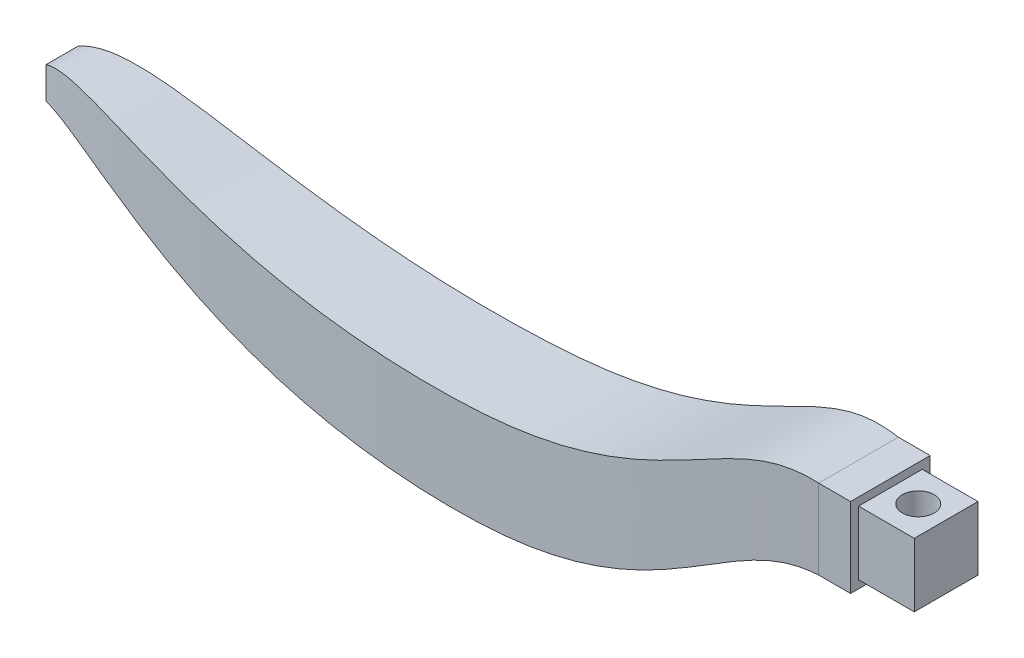
ISO-10303-21;
HEADER;
FILE_DESCRIPTION(('STEP AP214'),'2;1');
FILE_NAME('part.step','',(''),(''),'','','');
FILE_SCHEMA(('AUTOMOTIVE_DESIGN { 1 0 10303 214 1 1 1 1 }'));
ENDSEC;
DATA;
#1=APPLICATION_CONTEXT('core data for automotive mechanical design processes');
#2=APPLICATION_PROTOCOL_DEFINITION('international standard','automotive_design',2000,#1);
#3=PRODUCT_CONTEXT('',#1,'mechanical');
#4=PRODUCT('Part','Part','',(#3));
#5=PRODUCT_RELATED_PRODUCT_CATEGORY('part','',(#4));
#6=PRODUCT_DEFINITION_FORMATION('','',#4);
#7=PRODUCT_DEFINITION_CONTEXT('part definition',#1,'design');
#8=PRODUCT_DEFINITION('design','',#6,#7);
#9=PRODUCT_DEFINITION_SHAPE('','',#8);
#10=(LENGTH_UNIT() NAMED_UNIT(*) SI_UNIT(.MILLI.,.METRE.));
#11=(NAMED_UNIT(*) PLANE_ANGLE_UNIT() SI_UNIT($,.RADIAN.));
#12=(NAMED_UNIT(*) SI_UNIT($,.STERADIAN.) SOLID_ANGLE_UNIT());
#13=UNCERTAINTY_MEASURE_WITH_UNIT(LENGTH_MEASURE(1.E-05),#10,'distance_accuracy_value','');
#14=(GEOMETRIC_REPRESENTATION_CONTEXT(3) GLOBAL_UNCERTAINTY_ASSIGNED_CONTEXT((#13)) GLOBAL_UNIT_ASSIGNED_CONTEXT((#10,
#11,#12)) REPRESENTATION_CONTEXT('',''));
#15=CARTESIAN_POINT('',(0.,0.,0.));
#16=DIRECTION('',(0.,0.,1.));
#17=DIRECTION('',(1.,0.,0.));
#18=AXIS2_PLACEMENT_3D('',#15,#16,#17);
#19=CARTESIAN_POINT('',(52.,-6.42194630806614E-12,0.));
#20=DIRECTION('',(1.,-1.23512311489549E-13,0.));
#21=DIRECTION('',(1.23512311489549E-13,1.,0.));
#22=AXIS2_PLACEMENT_3D('',#19,#20,#21);
#23=PLANE('',#22);
#24=DIRECTION('',(-1.23512311489549E-13,-1.,0.));
#25=VECTOR('',#24,1.);
#26=CARTESIAN_POINT('',(52.0000000000006,4.99999999999358,2.5));
#27=LINE('',#26,#25);
#28=CARTESIAN_POINT('',(52.0000000000006,4.99999999999358,2.5));
#29=VERTEX_POINT('',#28);
#30=CARTESIAN_POINT('',(52.,-6.42194630806614E-12,2.5));
#31=VERTEX_POINT('',#30);
#32=EDGE_CURVE('E293',#29,#31,#27,.T.);
#33=ORIENTED_EDGE('',*,*,#32,.T.);
#34=DIRECTION('',(0.,0.,-1.));
#35=VECTOR('',#34,1.);
#36=CARTESIAN_POINT('',(52.,-6.42194630806614E-12,2.5));
#37=LINE('',#36,#35);
#38=CARTESIAN_POINT('',(52.,-6.42194630806614E-12,-2.5));
#39=VERTEX_POINT('',#38);
#40=EDGE_CURVE('E290',#31,#39,#37,.T.);
#41=ORIENTED_EDGE('',*,*,#40,.T.);
#42=DIRECTION('',(1.23512311489549E-13,1.,0.));
#43=VECTOR('',#42,1.);
#44=CARTESIAN_POINT('',(52.,-6.42194630806614E-12,-2.5));
#45=LINE('',#44,#43);
#46=CARTESIAN_POINT('',(52.0000000000006,4.99999999999358,-2.5));
#47=VERTEX_POINT('',#46);
#48=EDGE_CURVE('E306',#39,#47,#45,.T.);
#49=ORIENTED_EDGE('',*,*,#48,.T.);
#50=DIRECTION('',(0.,0.,1.));
#51=VECTOR('',#50,1.);
#52=CARTESIAN_POINT('',(52.0000000000006,4.99999999999358,-2.5));
#53=LINE('',#52,#51);
#54=EDGE_CURVE('E220',#47,#29,#53,.T.);
#55=ORIENTED_EDGE('',*,*,#54,.T.);
#56=EDGE_LOOP('',(#33,#41,#49,#55));
#57=FACE_BOUND('',#56,.T.);
#58=DIRECTION('',(0.,0.,-1.));
#59=VECTOR('',#58,1.);
#60=CARTESIAN_POINT('',(52.0000000000001,0.499999999999753,2.));
#61=LINE('',#60,#59);
#62=CARTESIAN_POINT('',(52.0000000000001,0.499999999999753,2.));
#63=VERTEX_POINT('',#62);
#64=CARTESIAN_POINT('',(52.0000000000001,0.499999999999753,-2.));
#65=VERTEX_POINT('',#64);
#66=EDGE_CURVE('E590',#63,#65,#61,.T.);
#67=ORIENTED_EDGE('',*,*,#66,.F.);
#68=DIRECTION('',(-1.23165366794353E-13,-1.,0.));
#69=VECTOR('',#68,1.);
#70=CARTESIAN_POINT('',(52.0000000000001,0.499999999999753,2.));
#71=LINE('',#70,#69);
#72=CARTESIAN_POINT('',(52.0000000000006,4.49999999999975,2.));
#73=VERTEX_POINT('',#72);
#74=EDGE_CURVE('E588',#73,#63,#71,.T.);
#75=ORIENTED_EDGE('',*,*,#74,.F.);
#76=DIRECTION('',(0.,0.,1.));
#77=VECTOR('',#76,1.);
#78=CARTESIAN_POINT('',(52.0000000000006,4.49999999999975,2.));
#79=LINE('',#78,#77);
#80=CARTESIAN_POINT('',(52.0000000000006,4.49999999999975,-2.));
#81=VERTEX_POINT('',#80);
#82=EDGE_CURVE('E598',#81,#73,#79,.T.);
#83=ORIENTED_EDGE('',*,*,#82,.F.);
#84=DIRECTION('',(1.23165366794353E-13,1.,0.));
#85=VECTOR('',#84,1.);
#86=CARTESIAN_POINT('',(52.0000000000001,0.499999999999753,-2.));
#87=LINE('',#86,#85);
#88=EDGE_CURVE('E610',#65,#81,#87,.T.);
#89=ORIENTED_EDGE('',*,*,#88,.F.);
#90=EDGE_LOOP('',(#67,#75,#83,#89));
#91=FACE_BOUND('',#90,.T.);
#92=ADVANCED_FACE('F127',(#57,#91),#23,.T.);
#93=CARTESIAN_POINT('',(0.,0.,0.));
#94=DIRECTION('',(-1.,0.,0.));
#95=DIRECTION('',(0.,0.,1.));
#96=AXIS2_PLACEMENT_3D('',#93,#94,#95);
#97=PLANE('',#96);
#98=DIRECTION('',(0.,-1.,0.));
#99=VECTOR('',#98,1.);
#100=CARTESIAN_POINT('',(0.,0.,1.));
#101=LINE('',#100,#99);
#102=CARTESIAN_POINT('',(0.,2.,1.));
#103=VERTEX_POINT('',#102);
#104=CARTESIAN_POINT('',(0.,0.,1.));
#105=VERTEX_POINT('',#104);
#106=EDGE_CURVE('E332',#103,#105,#101,.T.);
#107=ORIENTED_EDGE('',*,*,#106,.F.);
#108=DIRECTION('',(0.,0.,1.));
#109=VECTOR('',#108,1.);
#110=CARTESIAN_POINT('',(0.,2.,1.));
#111=LINE('',#110,#109);
#112=CARTESIAN_POINT('',(0.,2.,-1.));
#113=VERTEX_POINT('',#112);
#114=EDGE_CURVE('E430',#113,#103,#111,.T.);
#115=ORIENTED_EDGE('',*,*,#114,.F.);
#116=DIRECTION('',(0.,1.,0.));
#117=VECTOR('',#116,1.);
#118=CARTESIAN_POINT('',(0.,0.,-1.));
#119=LINE('',#118,#117);
#120=CARTESIAN_POINT('',(0.,0.,-1.));
#121=VERTEX_POINT('',#120);
#122=EDGE_CURVE('E139',#121,#113,#119,.T.);
#123=ORIENTED_EDGE('',*,*,#122,.F.);
#124=DIRECTION('',(0.,0.,-1.));
#125=VECTOR('',#124,1.);
#126=CARTESIAN_POINT('',(0.,0.,1.));
#127=LINE('',#126,#125);
#128=EDGE_CURVE('E13',#105,#121,#127,.T.);
#129=ORIENTED_EDGE('',*,*,#128,.F.);
#130=EDGE_LOOP('',(#107,#115,#123,#129));
#131=FACE_BOUND('',#130,.T.);
#132=ADVANCED_FACE('F271',(#131),#97,.T.);
#133=CARTESIAN_POINT('',(0.,0.,1.));
#134=CARTESIAN_POINT('',(3.37754548393812,0.,1.80499264812324));
#135=CARTESIAN_POINT('',(10.5549253003421,-6.64147305263549,2.69942892381574));
#136=CARTESIAN_POINT('',(26.8328566606422,-7.4116096272125,3.00346487893224));
#137=CARTESIAN_POINT('',(41.0016631618634,-6.80182643287604,3.15139697592948));
#138=CARTESIAN_POINT('',(44.5894445033844,1.54997542578528E-12,2.80855646228239));
#139=CARTESIAN_POINT('',(50.,0.,2.5));
#140=CARTESIAN_POINT('',(0.,0.,0.916666666666667));
#141=CARTESIAN_POINT('',(3.37754548393812,0.,1.65457659411297));
#142=CARTESIAN_POINT('',(10.5549253003421,-6.64147305263549,2.47447651349776));
#143=CARTESIAN_POINT('',(26.8328566606422,-7.4116096272125,2.75317613902122));
#144=CARTESIAN_POINT('',(41.0016631618634,-6.80182643287604,2.88878056126869));
#145=CARTESIAN_POINT('',(44.5894445033844,1.54997542578528E-12,2.57451009042552));
#146=CARTESIAN_POINT('',(50.,0.,2.29166666666667));
#147=CARTESIAN_POINT('',(0.,0.,0.750000000000001));
#148=CARTESIAN_POINT('',(3.37754548393812,0.,1.35374448609243));
#149=CARTESIAN_POINT('',(10.5549253003421,-6.6414730526355,2.0245716928618));
#150=CARTESIAN_POINT('',(26.8328566606422,-7.41160962721251,2.25259865919919));
#151=CARTESIAN_POINT('',(41.0016631618635,-6.80182643287605,2.36354773194711));
#152=CARTESIAN_POINT('',(44.5894445033845,1.54607229796433E-12,2.10641734671179));
#153=CARTESIAN_POINT('',(50.,0.,1.875));
#154=CARTESIAN_POINT('',(0.,0.,0.5));
#155=CARTESIAN_POINT('',(3.37754548393812,0.,0.902496324061619));
#156=CARTESIAN_POINT('',(10.5549253003421,-6.64147305263548,1.34971446190786));
#157=CARTESIAN_POINT('',(26.8328566606422,-7.41160962721249,1.50173243946612));
#158=CARTESIAN_POINT('',(41.0016631618634,-6.80182643287604,1.57569848796474));
#159=CARTESIAN_POINT('',(44.5894445033844,1.55387855360622E-12,1.40427823114119));
#160=CARTESIAN_POINT('',(49.9999999999999,0.,1.25));
#161=CARTESIAN_POINT('',(0.,0.,0.25));
#162=CARTESIAN_POINT('',(3.37754548393811,0.,0.45124816203081));
#163=CARTESIAN_POINT('',(10.5549253003421,-6.6414730526355,0.674857230953933));
#164=CARTESIAN_POINT('',(26.8328566606422,-7.41160962721251,0.750866219733061));
#165=CARTESIAN_POINT('',(41.0016631618635,-6.80182643287605,0.78784924398237));
#166=CARTESIAN_POINT('',(44.5894445033845,1.54780702144031E-12,0.702139115570597));
#167=CARTESIAN_POINT('',(50.0000000000001,0.,0.625000000000001));
#168=CARTESIAN_POINT('',(0.,0.,0.0833333333333333));
#169=CARTESIAN_POINT('',(3.37754548393812,0.,0.15041605401027));
#170=CARTESIAN_POINT('',(10.5549253003421,-6.64147305263549,0.224952410317978));
#171=CARTESIAN_POINT('',(26.8328566606422,-7.4116096272125,0.25028873991102));
#172=CARTESIAN_POINT('',(41.0016631618634,-6.80182643287604,0.26261641466079));
#173=CARTESIAN_POINT('',(44.5894445033844,1.54997542578528E-12,0.234046371856865));
#174=CARTESIAN_POINT('',(50.,0.,0.208333333333333));
#175=CARTESIAN_POINT('',(0.,0.,-0.0833333333333333));
#176=CARTESIAN_POINT('',(3.37754548393812,0.,-0.15041605401027));
#177=CARTESIAN_POINT('',(10.5549253003421,-6.64147305263549,-0.224952410317978));
#178=CARTESIAN_POINT('',(26.8328566606422,-7.4116096272125,-0.25028873991102));
#179=CARTESIAN_POINT('',(41.0016631618634,-6.80182643287604,-0.26261641466079));
#180=CARTESIAN_POINT('',(44.5894445033844,1.54997542578528E-12,-0.234046371856865));
#181=CARTESIAN_POINT('',(50.,0.,-0.208333333333333));
#182=CARTESIAN_POINT('',(0.,0.,-0.25));
#183=CARTESIAN_POINT('',(3.37754548393813,0.,-0.451248162030811));
#184=CARTESIAN_POINT('',(10.5549253003421,-6.6414730526355,-0.674857230953933));
#185=CARTESIAN_POINT('',(26.8328566606422,-7.41160962721252,-0.750866219733061));
#186=CARTESIAN_POINT('',(41.0016631618635,-6.80182643287606,-0.78784924398237));
#187=CARTESIAN_POINT('',(44.5894445033845,1.54347021275036E-12,-0.702139115570597));
#188=CARTESIAN_POINT('',(50.,0.,-0.625000000000001));
#189=CARTESIAN_POINT('',(0.,0.,-0.5));
#190=CARTESIAN_POINT('',(3.3775454839381,0.,-0.902496324061621));
#191=CARTESIAN_POINT('',(10.5549253003421,-6.64147305263548,-1.34971446190787));
#192=CARTESIAN_POINT('',(26.8328566606421,-7.41160962721249,-1.50173243946612));
#193=CARTESIAN_POINT('',(41.0016631618634,-6.80182643287603,-1.57569848796474));
#194=CARTESIAN_POINT('',(44.5894445033844,1.5560469579512E-12,-1.40427823114119));
#195=CARTESIAN_POINT('',(50.,0.,-1.25));
#196=CARTESIAN_POINT('',(0.,0.,-0.75));
#197=CARTESIAN_POINT('',(3.37754548393813,0.,-1.35374448609243));
#198=CARTESIAN_POINT('',(10.5549253003421,-6.6414730526355,-2.0245716928618));
#199=CARTESIAN_POINT('',(26.8328566606422,-7.41160962721251,-2.25259865919918));
#200=CARTESIAN_POINT('',(41.0016631618635,-6.80182643287606,-2.36354773194711));
#201=CARTESIAN_POINT('',(44.5894445033845,1.54563861709534E-12,-2.10641734671179));
#202=CARTESIAN_POINT('',(50.,0.,-1.875));
#203=CARTESIAN_POINT('',(0.,0.,-0.916666666666667));
#204=CARTESIAN_POINT('',(3.37754548393812,0.,-1.65457659411297));
#205=CARTESIAN_POINT('',(10.5549253003421,-6.64147305263549,-2.47447651349776));
#206=CARTESIAN_POINT('',(26.8328566606422,-7.4116096272125,-2.75317613902122));
#207=CARTESIAN_POINT('',(41.0016631618634,-6.80182643287604,-2.88878056126869));
#208=CARTESIAN_POINT('',(44.5894445033844,1.54997542578528E-12,-2.57451009042552));
#209=CARTESIAN_POINT('',(50.,0.,-2.29166666666667));
#210=CARTESIAN_POINT('',(0.,0.,-1.));
#211=CARTESIAN_POINT('',(3.37754548393812,0.,-1.80499264812324));
#212=CARTESIAN_POINT('',(10.5549253003421,-6.64147305263549,-2.69942892381574));
#213=CARTESIAN_POINT('',(26.8328566606422,-7.4116096272125,-3.00346487893224));
#214=CARTESIAN_POINT('',(41.0016631618634,-6.80182643287604,-3.15139697592948));
#215=CARTESIAN_POINT('',(44.5894445033844,1.55084278752327E-12,-2.80855646228239));
#216=CARTESIAN_POINT('',(50.,0.,-2.5));
#217=B_SPLINE_SURFACE_WITH_KNOTS('',3,3,((#133,#134,#135,#136,#137,#138,#139),(#140,#141,#142,
#143,#144,#145,#146),(#147,#148,#149,#150,#151,#152,#153),(#154,#155,#156,#157,#158,#159,#160),
(#161,#162,#163,#164,#165,#166,#167),(#168,#169,#170,#171,#172,#173,#174),(#175,#176,#177,#178,
#179,#180,#181),(#182,#183,#184,#185,#186,#187,#188),(#189,#190,#191,#192,#193,#194,#195),(#196,
#197,#198,#199,#200,#201,#202),(#203,#204,#205,#206,#207,#208,#209),(#210,#211,#212,#213,#214,
#215,#216)),.UNSPECIFIED.,.F.,.F.,.F.,(4,1,1,1,2,1,1,1,4),(4,1,1,1,4),(0.75,0.78125,0.8125,
0.84375,0.875,0.90625,0.9375,0.96875,1.),(0.,0.47885747228089,0.532063858089878,
0.57885747228089,1.),.UNSPECIFIED.);
#218=CARTESIAN_POINT('',(0.,0.,-1.));
#219=CARTESIAN_POINT('',(3.37754548393812,0.,-1.80499264812324));
#220=CARTESIAN_POINT('',(10.5549253003421,-6.64147305263549,-2.69942892381574));
#221=CARTESIAN_POINT('',(26.8328566606422,-7.4116096272125,-3.00346487893224));
#222=CARTESIAN_POINT('',(41.0016631618634,-6.80182643287604,-3.15139697592948));
#223=CARTESIAN_POINT('',(44.5894445033844,1.55084278752327E-12,-2.80855646228239));
#224=CARTESIAN_POINT('',(50.,0.,-2.5));
#225=B_SPLINE_CURVE_WITH_KNOTS('',3,(#218,#219,#220,#221,#222,#223,#224),.UNSPECIFIED.,.F.,.F.,
(4,1,1,1,4),(0.,0.47885747228089,0.532063858089878,0.57885747228089,1.),.UNSPECIFIED.);
#226=CARTESIAN_POINT('',(50.,0.,-2.5));
#227=VERTEX_POINT('',#226);
#228=EDGE_CURVE('E156',#121,#227,#225,.T.);
#229=DIRECTION('',(0.,0.,-1.));
#230=VECTOR('',#229,1.);
#231=CARTESIAN_POINT('',(50.,0.,2.5));
#232=LINE('',#231,#230);
#233=CARTESIAN_POINT('',(50.,0.,2.5));
#234=VERTEX_POINT('',#233);
#235=EDGE_CURVE('E202',#234,#227,#232,.T.);
#236=CARTESIAN_POINT('',(0.,0.,1.));
#237=CARTESIAN_POINT('',(3.37754548393812,0.,1.80499264812324));
#238=CARTESIAN_POINT('',(10.5549253003421,-6.64147305263549,2.69942892381574));
#239=CARTESIAN_POINT('',(26.8328566606422,-7.4116096272125,3.00346487893224));
#240=CARTESIAN_POINT('',(41.0016631618634,-6.80182643287604,3.15139697592948));
#241=CARTESIAN_POINT('',(44.5894445033844,1.54997542578528E-12,2.80855646228239));
#242=CARTESIAN_POINT('',(50.,0.,2.5));
#243=B_SPLINE_CURVE_WITH_KNOTS('',3,(#236,#237,#238,#239,#240,#241,#242),.UNSPECIFIED.,.F.,.F.,
(4,1,1,1,4),(0.,0.47885747228089,0.532063858089878,0.57885747228089,1.),.UNSPECIFIED.);
#244=EDGE_CURVE('E317',#105,#234,#243,.T.);
#245=ORIENTED_EDGE('',*,*,#128,.T.);
#246=ORIENTED_EDGE('',*,*,#228,.T.);
#247=ORIENTED_EDGE('',*,*,#235,.F.);
#248=ORIENTED_EDGE('',*,*,#244,.F.);
#249=EDGE_LOOP('',(#245,#246,#247,#248));
#250=FACE_BOUND('',#249,.T.);
#251=ADVANCED_FACE('F129',(#250),#217,.T.);
#252=CARTESIAN_POINT('',(0.,2.,1.));
#253=CARTESIAN_POINT('',(3.37754548392736,3.60998529624649,1.80499264812324));
#254=CARTESIAN_POINT('',(10.5549253003194,-1.24261520500402,2.69942892381573));
#255=CARTESIAN_POINT('',(26.8328566606193,-1.40467986934801,3.00346487893224));
#256=CARTESIAN_POINT('',(41.0016631618428,-0.499032481017083,3.15139697592948));
#257=CARTESIAN_POINT('',(44.589444503375,5.61711292456632,2.80855646228239));
#258=CARTESIAN_POINT('',(50.0000000000006,5.,2.5));
#259=CARTESIAN_POINT('',(0.,1.83333333333333,1.));
#260=CARTESIAN_POINT('',(3.37754548392826,3.30915318822594,1.80499264812324));
#261=CARTESIAN_POINT('',(10.5549253003213,-1.69252002563998,2.69942892381573));
#262=CARTESIAN_POINT('',(26.8328566606212,-1.90525734917005,3.00346487893224));
#263=CARTESIAN_POINT('',(41.0016631618446,-1.02426531033866,3.15139697592948));
#264=CARTESIAN_POINT('',(44.5894445033758,5.14902018085259,2.80855646228239));
#265=CARTESIAN_POINT('',(50.0000000000006,4.58333333333333,2.5));
#266=CARTESIAN_POINT('',(0.,1.5,1.));
#267=CARTESIAN_POINT('',(3.37754548393006,2.70748897218486,1.80499264812324));
#268=CARTESIAN_POINT('',(10.5549253003251,-2.59232966691189,2.69942892381574));
#269=CARTESIAN_POINT('',(26.832856660625,-2.90641230881414,3.00346487893225));
#270=CARTESIAN_POINT('',(41.001663161848,-2.07473096898183,3.15139697592948));
#271=CARTESIAN_POINT('',(44.5894445033774,4.21283469342513,2.80855646228239));
#272=CARTESIAN_POINT('',(50.0000000000005,3.75,2.5));
#273=CARTESIAN_POINT('',(0.,0.999999999999999,0.999999999999999));
#274=CARTESIAN_POINT('',(3.37754548393274,1.80499264812324,1.80499264812324));
#275=CARTESIAN_POINT('',(10.5549253003308,-3.94204412881975,2.69942892381573));
#276=CARTESIAN_POINT('',(26.8328566606307,-4.40814474828025,3.00346487893224));
#277=CARTESIAN_POINT('',(41.0016631618531,-3.65042945694656,3.15139697592948));
#278=CARTESIAN_POINT('',(44.5894445033797,2.80855646228394,2.80855646228238));
#279=CARTESIAN_POINT('',(50.0000000000003,2.5,2.5));
#280=CARTESIAN_POINT('',(0.,0.5,1.));
#281=CARTESIAN_POINT('',(3.37754548393543,0.902496324061621,1.80499264812324));
#282=CARTESIAN_POINT('',(10.5549253003364,-5.29175859072762,2.69942892381574));
#283=CARTESIAN_POINT('',(26.8328566606365,-5.90987718774638,3.00346487893225));
#284=CARTESIAN_POINT('',(41.0016631618583,-5.2261279449113,3.15139697592948));
#285=CARTESIAN_POINT('',(44.5894445033821,1.40427823114274,2.80855646228239));
#286=CARTESIAN_POINT('',(50.0000000000002,1.25,2.5));
#287=CARTESIAN_POINT('',(0.,0.166666666666667,1.));
#288=CARTESIAN_POINT('',(3.37754548393722,0.300832108020542,1.80499264812324));
#289=CARTESIAN_POINT('',(10.5549253003402,-6.19156823199953,2.69942892381574));
#290=CARTESIAN_POINT('',(26.8328566606402,-6.91103214739046,3.00346487893224));
#291=CARTESIAN_POINT('',(41.0016631618617,-6.27659360355446,3.15139697592948));
#292=CARTESIAN_POINT('',(44.5894445033837,0.468092743715283,2.80855646228239));
#293=CARTESIAN_POINT('',(50.0000000000001,0.416666666666667,2.5));
#294=CARTESIAN_POINT('',(0.,0.,1.));
#295=CARTESIAN_POINT('',(3.37754548393812,0.,1.80499264812324));
#296=CARTESIAN_POINT('',(10.5549253003421,-6.64147305263549,2.69942892381574));
#297=CARTESIAN_POINT('',(26.8328566606422,-7.4116096272125,3.00346487893224));
#298=CARTESIAN_POINT('',(41.0016631618634,-6.80182643287604,3.15139697592948));
#299=CARTESIAN_POINT('',(44.5894445033844,1.54997542578528E-12,2.80855646228239));
#300=CARTESIAN_POINT('',(50.,0.,2.5));
#301=B_SPLINE_SURFACE_WITH_KNOTS('',3,3,((#252,#253,#254,#255,#256,#257,#258),(#259,#260,#261,
#262,#263,#264,#265),(#266,#267,#268,#269,#270,#271,#272),(#273,#274,#275,#276,#277,#278,#279),
(#280,#281,#282,#283,#284,#285,#286),(#287,#288,#289,#290,#291,#292,#293),(#294,#295,#296,#297,
#298,#299,#300)),.UNSPECIFIED.,.F.,.F.,.F.,(4,1,1,1,4),(4,1,1,1,4),(0.5,0.5625,0.625,0.6875,
0.75),(0.,0.47885747228089,0.532063858089878,0.57885747228089,1.),.UNSPECIFIED.);
#302=DIRECTION('',(-1.23512311489549E-13,-1.,0.));
#303=VECTOR('',#302,1.);
#304=CARTESIAN_POINT('',(50.,0.,2.5));
#305=LINE('',#304,#303);
#306=CARTESIAN_POINT('',(50.0000000000006,4.99999999999382,2.5));
#307=VERTEX_POINT('',#306);
#308=EDGE_CURVE('E193',#307,#234,#305,.T.);
#309=CARTESIAN_POINT('',(0.,2.,1.));
#310=CARTESIAN_POINT('',(3.37754548392736,3.60998529624649,1.80499264812324));
#311=CARTESIAN_POINT('',(10.5549253003194,-1.24261520500402,2.69942892381573));
#312=CARTESIAN_POINT('',(26.8328566606193,-1.40467986934801,3.00346487893224));
#313=CARTESIAN_POINT('',(41.0016631618428,-0.499032481017083,3.15139697592948));
#314=CARTESIAN_POINT('',(44.589444503375,5.61711292456632,2.80855646228239));
#315=CARTESIAN_POINT('',(50.0000000000006,5.,2.5));
#316=B_SPLINE_CURVE_WITH_KNOTS('',3,(#309,#310,#311,#312,#313,#314,#315),.UNSPECIFIED.,.F.,.F.,
(4,1,1,1,4),(0.,0.47885747228089,0.532063858089878,0.57885747228089,1.),.UNSPECIFIED.);
#317=EDGE_CURVE('E185',#103,#307,#316,.T.);
#318=ORIENTED_EDGE('',*,*,#106,.T.);
#319=ORIENTED_EDGE('',*,*,#244,.T.);
#320=ORIENTED_EDGE('',*,*,#308,.F.);
#321=ORIENTED_EDGE('',*,*,#317,.F.);
#322=EDGE_LOOP('',(#318,#319,#320,#321));
#323=FACE_BOUND('',#322,.T.);
#324=ADVANCED_FACE('F384',(#323),#301,.T.);
#325=CARTESIAN_POINT('',(0.,2.,-1.));
#326=CARTESIAN_POINT('',(3.37754548392736,3.60998529624649,-1.80499264812324));
#327=CARTESIAN_POINT('',(10.5549253003194,-1.24261520500402,-2.69942892381573));
#328=CARTESIAN_POINT('',(26.8328566606193,-1.40467986934801,-3.00346487893224));
#329=CARTESIAN_POINT('',(41.0016631618428,-0.499032481017083,-3.15139697592948));
#330=CARTESIAN_POINT('',(44.589444503375,5.61711292456632,-2.80855646228239));
#331=CARTESIAN_POINT('',(50.0000000000006,5.,-2.5));
#332=CARTESIAN_POINT('',(0.,2.,-0.833333333333333));
#333=CARTESIAN_POINT('',(3.37754548392736,3.60998529624649,-1.5041605401027));
#334=CARTESIAN_POINT('',(10.5549253003194,-1.24261520500402,-2.24952410317978));
#335=CARTESIAN_POINT('',(26.8328566606193,-1.40467986934801,-2.5028873991102));
#336=CARTESIAN_POINT('',(41.0016631618428,-0.499032481017083,-2.6261641466079));
#337=CARTESIAN_POINT('',(44.589444503375,5.61711292456632,-2.34046371856865));
#338=CARTESIAN_POINT('',(50.0000000000006,5.,-2.08333333333333));
#339=CARTESIAN_POINT('',(0.,2.,-0.5));
#340=CARTESIAN_POINT('',(3.37754548392737,3.60998529624649,-0.902496324061621));
#341=CARTESIAN_POINT('',(10.5549253003194,-1.24261520500402,-1.34971446190787));
#342=CARTESIAN_POINT('',(26.8328566606193,-1.40467986934801,-1.50173243946612));
#343=CARTESIAN_POINT('',(41.0016631618429,-0.499032481017083,-1.57569848796474));
#344=CARTESIAN_POINT('',(44.5894445033751,5.61711292456632,-1.40427823114119));
#345=CARTESIAN_POINT('',(50.0000000000007,5.,-1.25));
#346=CARTESIAN_POINT('',(0.,2.,0.));
#347=CARTESIAN_POINT('',(3.37754548392735,3.60998529624648,0.));
#348=CARTESIAN_POINT('',(10.5549253003194,-1.24261520500402,0.));
#349=CARTESIAN_POINT('',(26.8328566606193,-1.40467986934801,0.));
#350=CARTESIAN_POINT('',(41.0016631618428,-0.499032481017084,0.));
#351=CARTESIAN_POINT('',(44.5894445033749,5.61711292456632,0.));
#352=CARTESIAN_POINT('',(50.0000000000006,5.,0.));
#353=CARTESIAN_POINT('',(0.,2.,0.5));
#354=CARTESIAN_POINT('',(3.37754548392737,3.60998529624649,0.902496324061621));
#355=CARTESIAN_POINT('',(10.5549253003194,-1.24261520500402,1.34971446190787));
#356=CARTESIAN_POINT('',(26.8328566606193,-1.40467986934801,1.50173243946612));
#357=CARTESIAN_POINT('',(41.0016631618429,-0.499032481017084,1.57569848796474));
#358=CARTESIAN_POINT('',(44.589444503375,5.61711292456632,1.40427823114119));
#359=CARTESIAN_POINT('',(50.0000000000006,5.,1.25));
#360=CARTESIAN_POINT('',(0.,2.,0.833333333333333));
#361=CARTESIAN_POINT('',(3.37754548392736,3.60998529624649,1.5041605401027));
#362=CARTESIAN_POINT('',(10.5549253003194,-1.24261520500402,2.24952410317978));
#363=CARTESIAN_POINT('',(26.8328566606193,-1.40467986934801,2.5028873991102));
#364=CARTESIAN_POINT('',(41.0016631618428,-0.499032481017083,2.6261641466079));
#365=CARTESIAN_POINT('',(44.589444503375,5.61711292456632,2.34046371856865));
#366=CARTESIAN_POINT('',(50.0000000000006,5.,2.08333333333333));
#367=CARTESIAN_POINT('',(0.,2.,1.));
#368=CARTESIAN_POINT('',(3.37754548392736,3.60998529624649,1.80499264812324));
#369=CARTESIAN_POINT('',(10.5549253003194,-1.24261520500402,2.69942892381573));
#370=CARTESIAN_POINT('',(26.8328566606193,-1.40467986934801,3.00346487893224));
#371=CARTESIAN_POINT('',(41.0016631618428,-0.499032481017083,3.15139697592948));
#372=CARTESIAN_POINT('',(44.589444503375,5.61711292456632,2.80855646228239));
#373=CARTESIAN_POINT('',(50.0000000000006,5.,2.5));
#374=B_SPLINE_SURFACE_WITH_KNOTS('',3,3,((#325,#326,#327,#328,#329,#330,#331),(#332,#333,#334,
#335,#336,#337,#338),(#339,#340,#341,#342,#343,#344,#345),(#346,#347,#348,#349,#350,#351,#352),
(#353,#354,#355,#356,#357,#358,#359),(#360,#361,#362,#363,#364,#365,#366),(#367,#368,#369,#370,
#371,#372,#373)),.UNSPECIFIED.,.F.,.F.,.F.,(4,1,1,1,4),(4,1,1,1,4),(0.25,0.3125,0.375,0.4375,
0.5),(0.,0.47885747228089,0.532063858089878,0.57885747228089,1.),.UNSPECIFIED.);
#375=DIRECTION('',(0.,0.,1.));
#376=VECTOR('',#375,1.);
#377=CARTESIAN_POINT('',(50.0000000000006,5.,2.5));
#378=LINE('',#377,#376);
#379=CARTESIAN_POINT('',(50.0000000000006,5.,-2.5));
#380=VERTEX_POINT('',#379);
#381=EDGE_CURVE('E177',#380,#307,#378,.T.);
#382=CARTESIAN_POINT('',(0.,2.,-1.));
#383=CARTESIAN_POINT('',(3.37754548392736,3.60998529624649,-1.80499264812324));
#384=CARTESIAN_POINT('',(10.5549253003194,-1.24261520500402,-2.69942892381573));
#385=CARTESIAN_POINT('',(26.8328566606193,-1.40467986934801,-3.00346487893224));
#386=CARTESIAN_POINT('',(41.0016631618428,-0.499032481017083,-3.15139697592948));
#387=CARTESIAN_POINT('',(44.589444503375,5.61711292456632,-2.80855646228239));
#388=CARTESIAN_POINT('',(50.0000000000006,5.,-2.5));
#389=B_SPLINE_CURVE_WITH_KNOTS('',3,(#382,#383,#384,#385,#386,#387,#388),.UNSPECIFIED.,.F.,.F.,
(4,1,1,1,4),(0.,0.47885747228089,0.532063858089878,0.57885747228089,1.),.UNSPECIFIED.);
#390=EDGE_CURVE('E181',#113,#380,#389,.T.);
#391=ORIENTED_EDGE('',*,*,#114,.T.);
#392=ORIENTED_EDGE('',*,*,#317,.T.);
#393=ORIENTED_EDGE('',*,*,#381,.F.);
#394=ORIENTED_EDGE('',*,*,#390,.F.);
#395=EDGE_LOOP('',(#391,#392,#393,#394));
#396=FACE_BOUND('',#395,.T.);
#397=ADVANCED_FACE('F180',(#396),#374,.T.);
#398=CARTESIAN_POINT('',(0.,0.,-1.));
#399=CARTESIAN_POINT('',(3.37754548393812,0.,-1.80499264812324));
#400=CARTESIAN_POINT('',(10.5549253003421,-6.64147305263549,-2.69942892381574));
#401=CARTESIAN_POINT('',(26.8328566606422,-7.4116096272125,-3.00346487893224));
#402=CARTESIAN_POINT('',(41.0016631618634,-6.80182643287604,-3.15139697592948));
#403=CARTESIAN_POINT('',(44.5894445033844,1.55084278752327E-12,-2.80855646228239));
#404=CARTESIAN_POINT('',(50.,0.,-2.5));
#405=CARTESIAN_POINT('',(0.,0.166666666666667,-1.));
#406=CARTESIAN_POINT('',(3.37754548393722,0.300832108020542,-1.80499264812324));
#407=CARTESIAN_POINT('',(10.5549253003402,-6.19156823199953,-2.69942892381574));
#408=CARTESIAN_POINT('',(26.8328566606402,-6.91103214739046,-3.00346487893224));
#409=CARTESIAN_POINT('',(41.0016631618617,-6.27659360355446,-3.15139697592948));
#410=CARTESIAN_POINT('',(44.5894445033837,0.468092743715283,-2.80855646228239));
#411=CARTESIAN_POINT('',(50.0000000000001,0.416666666666667,-2.5));
#412=CARTESIAN_POINT('',(0.,0.500000000000001,-1.));
#413=CARTESIAN_POINT('',(3.37754548393544,0.902496324061618,-1.80499264812324));
#414=CARTESIAN_POINT('',(10.5549253003364,-5.29175859072763,-2.69942892381574));
#415=CARTESIAN_POINT('',(26.8328566606365,-5.90987718774639,-3.00346487893225));
#416=CARTESIAN_POINT('',(41.0016631618583,-5.22612794491131,-3.15139697592948));
#417=CARTESIAN_POINT('',(44.5894445033821,1.40427823114274,-2.80855646228239));
#418=CARTESIAN_POINT('',(50.0000000000002,1.25,-2.5));
#419=CARTESIAN_POINT('',(0.,0.999999999999999,-0.999999999999999));
#420=CARTESIAN_POINT('',(3.37754548393273,1.80499264812325,-1.80499264812324));
#421=CARTESIAN_POINT('',(10.5549253003307,-3.94204412881975,-2.69942892381573));
#422=CARTESIAN_POINT('',(26.8328566606307,-4.40814474828025,-3.00346487893224));
#423=CARTESIAN_POINT('',(41.0016631618531,-3.65042945694656,-3.15139697592948));
#424=CARTESIAN_POINT('',(44.5894445033797,2.80855646228394,-2.80855646228238));
#425=CARTESIAN_POINT('',(50.0000000000002,2.5,-2.5));
#426=CARTESIAN_POINT('',(0.,1.5,-1.));
#427=CARTESIAN_POINT('',(3.37754548393005,2.70748897218486,-1.80499264812324));
#428=CARTESIAN_POINT('',(10.5549253003251,-2.59232966691189,-2.69942892381574));
#429=CARTESIAN_POINT('',(26.832856660625,-2.90641230881414,-3.00346487893224));
#430=CARTESIAN_POINT('',(41.001663161848,-2.07473096898183,-3.15139697592948));
#431=CARTESIAN_POINT('',(44.5894445033774,4.21283469342513,-2.80855646228239));
#432=CARTESIAN_POINT('',(50.0000000000005,3.75,-2.5));
#433=CARTESIAN_POINT('',(0.,1.83333333333333,-1.));
#434=CARTESIAN_POINT('',(3.37754548392826,3.30915318822594,-1.80499264812324));
#435=CARTESIAN_POINT('',(10.5549253003213,-1.69252002563998,-2.69942892381573));
#436=CARTESIAN_POINT('',(26.8328566606212,-1.90525734917005,-3.00346487893224));
#437=CARTESIAN_POINT('',(41.0016631618446,-1.02426531033866,-3.15139697592948));
#438=CARTESIAN_POINT('',(44.5894445033758,5.14902018085259,-2.80855646228239));
#439=CARTESIAN_POINT('',(50.0000000000006,4.58333333333333,-2.5));
#440=CARTESIAN_POINT('',(0.,2.,-1.));
#441=CARTESIAN_POINT('',(3.37754548392736,3.60998529624649,-1.80499264812324));
#442=CARTESIAN_POINT('',(10.5549253003194,-1.24261520500402,-2.69942892381573));
#443=CARTESIAN_POINT('',(26.8328566606193,-1.40467986934801,-3.00346487893224));
#444=CARTESIAN_POINT('',(41.0016631618428,-0.499032481017083,-3.15139697592948));
#445=CARTESIAN_POINT('',(44.589444503375,5.61711292456632,-2.80855646228239));
#446=CARTESIAN_POINT('',(50.0000000000006,5.,-2.5));
#447=B_SPLINE_SURFACE_WITH_KNOTS('',3,3,((#398,#399,#400,#401,#402,#403,#404),(#405,#406,#407,
#408,#409,#410,#411),(#412,#413,#414,#415,#416,#417,#418),(#419,#420,#421,#422,#423,#424,#425),
(#426,#427,#428,#429,#430,#431,#432),(#433,#434,#435,#436,#437,#438,#439),(#440,#441,#442,#443,
#444,#445,#446)),.UNSPECIFIED.,.F.,.F.,.F.,(4,1,1,1,4),(4,1,1,1,4),(0.,0.0625,0.125,0.1875,
0.25),(0.,0.47885747228089,0.532063858089878,0.57885747228089,1.),.UNSPECIFIED.);
#448=DIRECTION('',(1.23512311489549E-13,1.,0.));
#449=VECTOR('',#448,1.);
#450=CARTESIAN_POINT('',(50.,0.,-2.5));
#451=LINE('',#450,#449);
#452=EDGE_CURVE('E192',#227,#380,#451,.T.);
#453=ORIENTED_EDGE('',*,*,#122,.T.);
#454=ORIENTED_EDGE('',*,*,#390,.T.);
#455=ORIENTED_EDGE('',*,*,#452,.F.);
#456=ORIENTED_EDGE('',*,*,#228,.F.);
#457=EDGE_LOOP('',(#453,#454,#455,#456));
#458=FACE_BOUND('',#457,.T.);
#459=ADVANCED_FACE('F198',(#458),#447,.T.);
#460=CARTESIAN_POINT('',(52.0000000000006,4.99999999999358,2.5));
#461=DIRECTION('',(0.,0.,-1.));
#462=DIRECTION('',(-1.,0.,0.));
#463=AXIS2_PLACEMENT_3D('',#460,#461,#462);
#464=PLANE('',#463);
#465=ORIENTED_EDGE('',*,*,#308,.T.);
#466=DIRECTION('',(-1.,1.23165366794353E-13,0.));
#467=VECTOR('',#466,1.);
#468=CARTESIAN_POINT('',(52.,-6.42194630806614E-12,2.5));
#469=LINE('',#468,#467);
#470=EDGE_CURVE('E223',#31,#234,#469,.T.);
#471=ORIENTED_EDGE('',*,*,#470,.F.);
#472=ORIENTED_EDGE('',*,*,#32,.F.);
#473=DIRECTION('',(-1.,1.23165366794353E-13,0.));
#474=VECTOR('',#473,1.);
#475=CARTESIAN_POINT('',(52.0000000000006,4.99999999999358,2.5));
#476=LINE('',#475,#474);
#477=EDGE_CURVE('E221',#29,#307,#476,.T.);
#478=ORIENTED_EDGE('',*,*,#477,.T.);
#479=EDGE_LOOP('',(#465,#471,#472,#478));
#480=FACE_BOUND('',#479,.T.);
#481=ADVANCED_FACE('F265',(#480),#464,.F.);
#482=CARTESIAN_POINT('',(52.,-6.42194630806614E-12,2.5));
#483=DIRECTION('',(1.23165366794353E-13,1.,0.));
#484=DIRECTION('',(-1.,1.23165366794353E-13,0.));
#485=AXIS2_PLACEMENT_3D('',#482,#483,#484);
#486=PLANE('',#485);
#487=ORIENTED_EDGE('',*,*,#235,.T.);
#488=DIRECTION('',(-1.,1.23165366794353E-13,0.));
#489=VECTOR('',#488,1.);
#490=CARTESIAN_POINT('',(52.,-6.42194630806614E-12,-2.5));
#491=LINE('',#490,#489);
#492=EDGE_CURVE('E214',#39,#227,#491,.T.);
#493=ORIENTED_EDGE('',*,*,#492,.F.);
#494=ORIENTED_EDGE('',*,*,#40,.F.);
#495=ORIENTED_EDGE('',*,*,#470,.T.);
#496=EDGE_LOOP('',(#487,#493,#494,#495));
#497=FACE_BOUND('',#496,.T.);
#498=ADVANCED_FACE('F256',(#497),#486,.F.);
#499=CARTESIAN_POINT('',(52.,-6.42194630806614E-12,-2.5));
#500=DIRECTION('',(0.,0.,1.));
#501=DIRECTION('',(1.,0.,0.));
#502=AXIS2_PLACEMENT_3D('',#499,#500,#501);
#503=PLANE('',#502);
#504=ORIENTED_EDGE('',*,*,#452,.T.);
#505=DIRECTION('',(-1.,1.23165366794353E-13,0.));
#506=VECTOR('',#505,1.);
#507=CARTESIAN_POINT('',(52.0000000000006,4.99999999999358,-2.5));
#508=LINE('',#507,#506);
#509=EDGE_CURVE('E211',#47,#380,#508,.T.);
#510=ORIENTED_EDGE('',*,*,#509,.F.);
#511=ORIENTED_EDGE('',*,*,#48,.F.);
#512=ORIENTED_EDGE('',*,*,#492,.T.);
#513=EDGE_LOOP('',(#504,#510,#511,#512));
#514=FACE_BOUND('',#513,.T.);
#515=ADVANCED_FACE('F208',(#514),#503,.F.);
#516=CARTESIAN_POINT('',(52.0000000000006,4.99999999999358,-2.5));
#517=DIRECTION('',(-1.23165366794353E-13,-1.,0.));
#518=DIRECTION('',(1.,-1.23165366794353E-13,0.));
#519=AXIS2_PLACEMENT_3D('',#516,#517,#518);
#520=PLANE('',#519);
#521=ORIENTED_EDGE('',*,*,#381,.T.);
#522=ORIENTED_EDGE('',*,*,#477,.F.);
#523=ORIENTED_EDGE('',*,*,#54,.F.);
#524=ORIENTED_EDGE('',*,*,#509,.T.);
#525=EDGE_LOOP('',(#521,#522,#523,#524));
#526=FACE_BOUND('',#525,.T.);
#527=ADVANCED_FACE('F218',(#526),#520,.F.);
#528=CARTESIAN_POINT('',(55.5000000000001,0.499999999999321,2.));
#529=DIRECTION('',(0.,0.,-1.));
#530=DIRECTION('',(-1.,0.,0.));
#531=AXIS2_PLACEMENT_3D('',#528,#529,#530);
#532=PLANE('',#531);
#533=ORIENTED_EDGE('',*,*,#74,.T.);
#534=DIRECTION('',(-1.,1.23512311489549E-13,0.));
#535=VECTOR('',#534,1.);
#536=CARTESIAN_POINT('',(55.5000000000001,0.499999999999321,2.));
#537=LINE('',#536,#535);
#538=CARTESIAN_POINT('',(55.5000000000001,0.499999999999321,2.));
#539=VERTEX_POINT('',#538);
#540=EDGE_CURVE('E619',#539,#63,#537,.T.);
#541=ORIENTED_EDGE('',*,*,#540,.F.);
#542=DIRECTION('',(-1.23165366794353E-13,-1.,0.));
#543=VECTOR('',#542,1.);
#544=CARTESIAN_POINT('',(55.5000000000001,0.499999999999321,2.));
#545=LINE('',#544,#543);
#546=CARTESIAN_POINT('',(55.5000000000006,4.49999999999932,2.));
#547=VERTEX_POINT('',#546);
#548=EDGE_CURVE('E594',#547,#539,#545,.T.);
#549=ORIENTED_EDGE('',*,*,#548,.F.);
#550=DIRECTION('',(-1.,1.23512311489549E-13,0.));
#551=VECTOR('',#550,1.);
#552=CARTESIAN_POINT('',(55.5000000000006,4.49999999999932,2.));
#553=LINE('',#552,#551);
#554=EDGE_CURVE('E606',#547,#73,#553,.T.);
#555=ORIENTED_EDGE('',*,*,#554,.T.);
#556=EDGE_LOOP('',(#533,#541,#549,#555));
#557=FACE_BOUND('',#556,.T.);
#558=ADVANCED_FACE('F465',(#557),#532,.F.);
#559=CARTESIAN_POINT('',(55.5000000000001,0.499999999999321,2.));
#560=DIRECTION('',(1.23512311489549E-13,1.,0.));
#561=DIRECTION('',(-1.,1.23512311489549E-13,0.));
#562=AXIS2_PLACEMENT_3D('',#559,#560,#561);
#563=PLANE('',#562);
#564=CARTESIAN_POINT('',(53.7500000000001,0.499999999999537,0.));
#565=DIRECTION('',(-1.23512311489549E-13,-1.,0.));
#566=DIRECTION('',(1.,-1.23512311489549E-13,0.));
#567=AXIS2_PLACEMENT_3D('',#564,#565,#566);
#568=CIRCLE('',#567,0.999999999999998);
#569=CARTESIAN_POINT('',(54.7500000000001,0.499999999999414,0.));
#570=VERTEX_POINT('',#569);
#571=EDGE_CURVE('E585',#570,#570,#568,.T.);
#572=ORIENTED_EDGE('',*,*,#571,.F.);
#573=EDGE_LOOP('',(#572));
#574=FACE_BOUND('',#573,.T.);
#575=ORIENTED_EDGE('',*,*,#66,.T.);
#576=DIRECTION('',(-1.,1.23512311489549E-13,0.));
#577=VECTOR('',#576,1.);
#578=CARTESIAN_POINT('',(55.5000000000001,0.499999999999321,-2.));
#579=LINE('',#578,#577);
#580=CARTESIAN_POINT('',(55.5000000000001,0.499999999999321,-2.));
#581=VERTEX_POINT('',#580);
#582=EDGE_CURVE('E616',#581,#65,#579,.T.);
#583=ORIENTED_EDGE('',*,*,#582,.F.);
#584=DIRECTION('',(0.,0.,-1.));
#585=VECTOR('',#584,1.);
#586=CARTESIAN_POINT('',(55.5000000000001,0.499999999999321,2.));
#587=LINE('',#586,#585);
#588=EDGE_CURVE('E597',#539,#581,#587,.T.);
#589=ORIENTED_EDGE('',*,*,#588,.F.);
#590=ORIENTED_EDGE('',*,*,#540,.T.);
#591=EDGE_LOOP('',(#575,#583,#589,#590));
#592=FACE_BOUND('',#591,.T.);
#593=ADVANCED_FACE('F473',(#574,#592),#563,.F.);
#594=CARTESIAN_POINT('',(55.5000000000001,0.499999999999321,-2.));
#595=DIRECTION('',(0.,0.,1.));
#596=DIRECTION('',(0.,-1.,0.));
#597=AXIS2_PLACEMENT_3D('',#594,#595,#596);
#598=PLANE('',#597);
#599=ORIENTED_EDGE('',*,*,#88,.T.);
#600=DIRECTION('',(-1.,1.23512311489549E-13,0.));
#601=VECTOR('',#600,1.);
#602=CARTESIAN_POINT('',(55.5000000000006,4.49999999999932,-2.));
#603=LINE('',#602,#601);
#604=CARTESIAN_POINT('',(55.5000000000006,4.49999999999932,-2.));
#605=VERTEX_POINT('',#604);
#606=EDGE_CURVE('E147',#605,#81,#603,.T.);
#607=ORIENTED_EDGE('',*,*,#606,.F.);
#608=DIRECTION('',(1.23165366794353E-13,1.,0.));
#609=VECTOR('',#608,1.);
#610=CARTESIAN_POINT('',(55.5000000000001,0.499999999999321,-2.));
#611=LINE('',#610,#609);
#612=EDGE_CURVE('E601',#581,#605,#611,.T.);
#613=ORIENTED_EDGE('',*,*,#612,.F.);
#614=ORIENTED_EDGE('',*,*,#582,.T.);
#615=EDGE_LOOP('',(#599,#607,#613,#614));
#616=FACE_BOUND('',#615,.T.);
#617=ADVANCED_FACE('F542',(#616),#598,.F.);
#618=CARTESIAN_POINT('',(55.5000000000006,4.49999999999932,2.));
#619=DIRECTION('',(-1.23512311489549E-13,-1.,0.));
#620=DIRECTION('',(1.,-1.23512311489549E-13,0.));
#621=AXIS2_PLACEMENT_3D('',#618,#619,#620);
#622=PLANE('',#621);
#623=CARTESIAN_POINT('',(53.7500000000006,4.49999999999954,0.));
#624=DIRECTION('',(-1.23512311489549E-13,-1.,0.));
#625=DIRECTION('',(1.,-1.23512311489549E-13,0.));
#626=AXIS2_PLACEMENT_3D('',#623,#624,#625);
#627=CIRCLE('',#626,0.999999999999998);
#628=CARTESIAN_POINT('',(54.7500000000006,4.49999999999941,0.));
#629=VERTEX_POINT('',#628);
#630=EDGE_CURVE('E134',#629,#629,#627,.T.);
#631=ORIENTED_EDGE('',*,*,#630,.T.);
#632=EDGE_LOOP('',(#631));
#633=FACE_BOUND('',#632,.T.);
#634=ORIENTED_EDGE('',*,*,#82,.T.);
#635=ORIENTED_EDGE('',*,*,#554,.F.);
#636=DIRECTION('',(0.,0.,1.));
#637=VECTOR('',#636,1.);
#638=CARTESIAN_POINT('',(55.5000000000006,4.49999999999932,2.));
#639=LINE('',#638,#637);
#640=EDGE_CURVE('E604',#605,#547,#639,.T.);
#641=ORIENTED_EDGE('',*,*,#640,.F.);
#642=ORIENTED_EDGE('',*,*,#606,.T.);
#643=EDGE_LOOP('',(#634,#635,#641,#642));
#644=FACE_BOUND('',#643,.T.);
#645=ADVANCED_FACE('F549',(#633,#644),#622,.F.);
#646=CARTESIAN_POINT('',(55.5,-6.83689216351979E-12,0.));
#647=DIRECTION('',(-1.,1.23165366794353E-13,0.));
#648=DIRECTION('',(-1.23165366794353E-13,-1.,0.));
#649=AXIS2_PLACEMENT_3D('',#646,#647,#648);
#650=PLANE('',#649);
#651=ORIENTED_EDGE('',*,*,#548,.T.);
#652=ORIENTED_EDGE('',*,*,#588,.T.);
#653=ORIENTED_EDGE('',*,*,#612,.T.);
#654=ORIENTED_EDGE('',*,*,#640,.T.);
#655=EDGE_LOOP('',(#651,#652,#653,#654));
#656=FACE_BOUND('',#655,.T.);
#657=ADVANCED_FACE('F559',(#656),#650,.F.);
#658=CARTESIAN_POINT('',(53.7500000000013,10.4999999999995,0.));
#659=DIRECTION('',(-1.23512311489549E-13,-1.,0.));
#660=DIRECTION('',(1.,-1.23512311489549E-13,0.));
#661=AXIS2_PLACEMENT_3D('',#658,#659,#660);
#662=CYLINDRICAL_SURFACE('',#661,0.999999999999998);
#663=ORIENTED_EDGE('',*,*,#571,.T.);
#664=EDGE_LOOP('',(#663));
#665=FACE_BOUND('',#664,.T.);
#666=ORIENTED_EDGE('',*,*,#630,.F.);
#667=EDGE_LOOP('',(#666));
#668=FACE_BOUND('',#667,.T.);
#669=ADVANCED_FACE('F567',(#665,#668),#662,.F.);
#670=CLOSED_SHELL('',(#92,#132,#251,#324,#397,#459,#481,#498,#515,#527,#558,#593,#617,#645,#657,#669));
#671=MANIFOLD_SOLID_BREP('B2',#670);
#672=ADVANCED_BREP_SHAPE_REPRESENTATION('',(#18,#671),#14);
#673=SHAPE_DEFINITION_REPRESENTATION(#9,#672);
ENDSEC;
END-ISO-10303-21;
